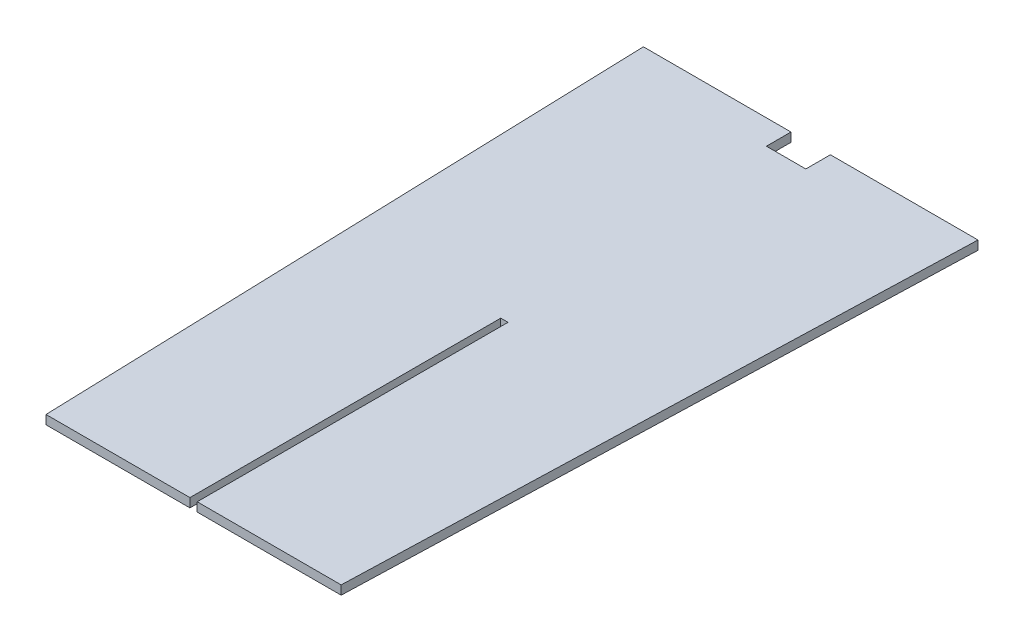
ISO-10303-21;
HEADER;
FILE_DESCRIPTION(('STEP AP214'),'2;1');
FILE_NAME('part.step','',(''),(''),'','','');
FILE_SCHEMA(('AUTOMOTIVE_DESIGN { 1 0 10303 214 1 1 1 1 }'));
ENDSEC;
DATA;
#1=APPLICATION_CONTEXT('core data for automotive mechanical design processes');
#2=APPLICATION_PROTOCOL_DEFINITION('international standard','automotive_design',2000,#1);
#3=PRODUCT_CONTEXT('',#1,'mechanical');
#4=PRODUCT('Part','Part','',(#3));
#5=PRODUCT_RELATED_PRODUCT_CATEGORY('part','',(#4));
#6=PRODUCT_DEFINITION_FORMATION('','',#4);
#7=PRODUCT_DEFINITION_CONTEXT('part definition',#1,'design');
#8=PRODUCT_DEFINITION('design','',#6,#7);
#9=PRODUCT_DEFINITION_SHAPE('','',#8);
#10=(LENGTH_UNIT() NAMED_UNIT(*) SI_UNIT(.MILLI.,.METRE.));
#11=(NAMED_UNIT(*) PLANE_ANGLE_UNIT() SI_UNIT($,.RADIAN.));
#12=(NAMED_UNIT(*) SI_UNIT($,.STERADIAN.) SOLID_ANGLE_UNIT());
#13=UNCERTAINTY_MEASURE_WITH_UNIT(LENGTH_MEASURE(1.E-05),#10,'distance_accuracy_value','');
#14=(GEOMETRIC_REPRESENTATION_CONTEXT(3) GLOBAL_UNCERTAINTY_ASSIGNED_CONTEXT((#13)) GLOBAL_UNIT_ASSIGNED_CONTEXT((#10,
#11,#12)) REPRESENTATION_CONTEXT('',''));
#15=CARTESIAN_POINT('',(0.,0.,0.));
#16=DIRECTION('',(0.,0.,1.));
#17=DIRECTION('',(1.,0.,0.));
#18=AXIS2_PLACEMENT_3D('',#15,#16,#17);
#19=CARTESIAN_POINT('',(262.6692014748,-6.35,-448.360447089144));
#20=DIRECTION('',(-0.999489318575964,0.,0.0319546874895447));
#21=DIRECTION('',(0.0319546874895447,0.,0.999489318575964));
#22=AXIS2_PLACEMENT_3D('',#19,#20,#21);
#23=PLANE('',#22);
#24=DIRECTION('',(0.0319546874895447,0.,0.999489318575964));
#25=VECTOR('',#24,1.);
#26=CARTESIAN_POINT('',(262.6692014748,0.,-448.360447089144));
#27=LINE('',#26,#25);
#28=CARTESIAN_POINT('',(262.6692014748,0.,-448.360447089144));
#29=VERTEX_POINT('',#28);
#30=CARTESIAN_POINT('',(276.6773014748,0.,-10.2104470891437));
#31=VERTEX_POINT('',#30);
#32=EDGE_CURVE('E166',#29,#31,#27,.T.);
#33=ORIENTED_EDGE('',*,*,#32,.F.);
#34=DIRECTION('',(0.,1.,0.));
#35=VECTOR('',#34,1.);
#36=CARTESIAN_POINT('',(262.6692014748,-6.35,-448.360447089144));
#37=LINE('',#36,#35);
#38=CARTESIAN_POINT('',(262.6692014748,-6.35,-448.360447089144));
#39=VERTEX_POINT('',#38);
#40=EDGE_CURVE('E11',#39,#29,#37,.T.);
#41=ORIENTED_EDGE('',*,*,#40,.F.);
#42=DIRECTION('',(0.0319546874895447,0.,0.999489318575964));
#43=VECTOR('',#42,1.);
#44=CARTESIAN_POINT('',(262.6692014748,-6.35,-448.360447089144));
#45=LINE('',#44,#43);
#46=CARTESIAN_POINT('',(276.6773014748,-6.35,-10.2104470891437));
#47=VERTEX_POINT('',#46);
#48=EDGE_CURVE('E210',#39,#47,#45,.T.);
#49=ORIENTED_EDGE('',*,*,#48,.T.);
#50=DIRECTION('',(0.,1.,0.));
#51=VECTOR('',#50,1.);
#52=CARTESIAN_POINT('',(276.6773014748,-6.35,-10.2104470891437));
#53=LINE('',#52,#51);
#54=EDGE_CURVE('E42',#47,#31,#53,.T.);
#55=ORIENTED_EDGE('',*,*,#54,.T.);
#56=EDGE_LOOP('',(#33,#41,#49,#55));
#57=FACE_BOUND('',#56,.T.);
#58=ADVANCED_FACE('F39',(#57),#23,.T.);
#59=CARTESIAN_POINT('',(262.6692014748,-6.35,-448.360447089144));
#60=DIRECTION('',(0.,0.,-1.));
#61=DIRECTION('',(-1.,0.,0.));
#62=AXIS2_PLACEMENT_3D('',#59,#60,#61);
#63=PLANE('',#62);
#64=DIRECTION('',(-1.,0.,0.));
#65=VECTOR('',#64,1.);
#66=CARTESIAN_POINT('',(262.6692014748,0.,-448.360447089144));
#67=LINE('',#66,#65);
#68=CARTESIAN_POINT('',(367.4632514748,0.,-448.360447089144));
#69=VERTEX_POINT('',#68);
#70=EDGE_CURVE('E207',#69,#29,#67,.T.);
#71=ORIENTED_EDGE('',*,*,#70,.F.);
#72=DIRECTION('',(0.,1.,0.));
#73=VECTOR('',#72,1.);
#74=CARTESIAN_POINT('',(367.4632514748,-6.35,-448.360447089144));
#75=LINE('',#74,#73);
#76=CARTESIAN_POINT('',(367.4632514748,-6.35,-448.360447089144));
#77=VERTEX_POINT('',#76);
#78=EDGE_CURVE('E49',#77,#69,#75,.T.);
#79=ORIENTED_EDGE('',*,*,#78,.F.);
#80=DIRECTION('',(-1.,0.,0.));
#81=VECTOR('',#80,1.);
#82=CARTESIAN_POINT('',(262.6692014748,-6.35,-448.360447089144));
#83=LINE('',#82,#81);
#84=EDGE_CURVE('E152',#77,#39,#83,.T.);
#85=ORIENTED_EDGE('',*,*,#84,.T.);
#86=ORIENTED_EDGE('',*,*,#40,.T.);
#87=EDGE_LOOP('',(#71,#79,#85,#86));
#88=FACE_BOUND('',#87,.T.);
#89=ADVANCED_FACE('F240',(#88),#63,.T.);
#90=CARTESIAN_POINT('',(367.4632514748,-6.35,-448.360447089144));
#91=DIRECTION('',(1.,0.,0.));
#92=DIRECTION('',(0.,0.,-1.));
#93=AXIS2_PLACEMENT_3D('',#90,#91,#92);
#94=PLANE('',#93);
#95=DIRECTION('',(0.,0.,-1.));
#96=VECTOR('',#95,1.);
#97=CARTESIAN_POINT('',(367.4632514748,0.,-448.360447089144));
#98=LINE('',#97,#96);
#99=CARTESIAN_POINT('',(367.4632514748,0.,-430.897947089144));
#100=VERTEX_POINT('',#99);
#101=EDGE_CURVE('E138',#100,#69,#98,.T.);
#102=ORIENTED_EDGE('',*,*,#101,.F.);
#103=DIRECTION('',(0.,1.,0.));
#104=VECTOR('',#103,1.);
#105=CARTESIAN_POINT('',(367.4632514748,-6.35,-430.897947089144));
#106=LINE('',#105,#104);
#107=CARTESIAN_POINT('',(367.4632514748,-6.35,-430.897947089144));
#108=VERTEX_POINT('',#107);
#109=EDGE_CURVE('E133',#108,#100,#106,.T.);
#110=ORIENTED_EDGE('',*,*,#109,.F.);
#111=DIRECTION('',(0.,0.,-1.));
#112=VECTOR('',#111,1.);
#113=CARTESIAN_POINT('',(367.4632514748,-6.35,-448.360447089144));
#114=LINE('',#113,#112);
#115=EDGE_CURVE('E136',#108,#77,#114,.T.);
#116=ORIENTED_EDGE('',*,*,#115,.T.);
#117=ORIENTED_EDGE('',*,*,#78,.T.);
#118=EDGE_LOOP('',(#102,#110,#116,#117));
#119=FACE_BOUND('',#118,.T.);
#120=ADVANCED_FACE('F135',(#119),#94,.T.);
#121=CARTESIAN_POINT('',(367.4632514748,-6.35,-430.897947089144));
#122=DIRECTION('',(0.,0.,-1.));
#123=DIRECTION('',(-1.,0.,0.));
#124=AXIS2_PLACEMENT_3D('',#121,#122,#123);
#125=PLANE('',#124);
#126=DIRECTION('',(-1.,0.,0.));
#127=VECTOR('',#126,1.);
#128=CARTESIAN_POINT('',(367.4632514748,0.,-430.897947089144));
#129=LINE('',#128,#127);
#130=CARTESIAN_POINT('',(395.4413514748,0.,-430.897947089144));
#131=VERTEX_POINT('',#130);
#132=EDGE_CURVE('E202',#131,#100,#129,.T.);
#133=ORIENTED_EDGE('',*,*,#132,.F.);
#134=DIRECTION('',(0.,1.,0.));
#135=VECTOR('',#134,1.);
#136=CARTESIAN_POINT('',(395.4413514748,-6.35,-430.897947089144));
#137=LINE('',#136,#135);
#138=CARTESIAN_POINT('',(395.4413514748,-6.35,-430.897947089144));
#139=VERTEX_POINT('',#138);
#140=EDGE_CURVE('E144',#139,#131,#137,.T.);
#141=ORIENTED_EDGE('',*,*,#140,.F.);
#142=DIRECTION('',(-1.,0.,0.));
#143=VECTOR('',#142,1.);
#144=CARTESIAN_POINT('',(367.4632514748,-6.35,-430.897947089144));
#145=LINE('',#144,#143);
#146=EDGE_CURVE('E150',#139,#108,#145,.T.);
#147=ORIENTED_EDGE('',*,*,#146,.T.);
#148=ORIENTED_EDGE('',*,*,#109,.T.);
#149=EDGE_LOOP('',(#133,#141,#147,#148));
#150=FACE_BOUND('',#149,.T.);
#151=ADVANCED_FACE('F155',(#150),#125,.T.);
#152=CARTESIAN_POINT('',(395.4413514748,-6.35,-448.360447089144));
#153=DIRECTION('',(-1.,0.,0.));
#154=DIRECTION('',(0.,0.,1.));
#155=AXIS2_PLACEMENT_3D('',#152,#153,#154);
#156=PLANE('',#155);
#157=DIRECTION('',(0.,0.,1.));
#158=VECTOR('',#157,1.);
#159=CARTESIAN_POINT('',(395.4413514748,0.,-448.360447089144));
#160=LINE('',#159,#158);
#161=CARTESIAN_POINT('',(395.4413514748,0.,-448.360447089144));
#162=VERTEX_POINT('',#161);
#163=EDGE_CURVE('E198',#162,#131,#160,.T.);
#164=ORIENTED_EDGE('',*,*,#163,.F.);
#165=DIRECTION('',(0.,1.,0.));
#166=VECTOR('',#165,1.);
#167=CARTESIAN_POINT('',(395.4413514748,-6.35,-448.360447089144));
#168=LINE('',#167,#166);
#169=CARTESIAN_POINT('',(395.4413514748,-6.35,-448.360447089144));
#170=VERTEX_POINT('',#169);
#171=EDGE_CURVE('E216',#170,#162,#168,.T.);
#172=ORIENTED_EDGE('',*,*,#171,.F.);
#173=DIRECTION('',(0.,0.,1.));
#174=VECTOR('',#173,1.);
#175=CARTESIAN_POINT('',(395.4413514748,-6.35,-448.360447089144));
#176=LINE('',#175,#174);
#177=EDGE_CURVE('E157',#170,#139,#176,.T.);
#178=ORIENTED_EDGE('',*,*,#177,.T.);
#179=ORIENTED_EDGE('',*,*,#140,.T.);
#180=EDGE_LOOP('',(#164,#172,#178,#179));
#181=FACE_BOUND('',#180,.T.);
#182=ADVANCED_FACE('F253',(#181),#156,.T.);
#183=CARTESIAN_POINT('',(395.4413514748,-6.35,-448.360447089144));
#184=DIRECTION('',(0.,0.,-1.));
#185=DIRECTION('',(-1.,0.,0.));
#186=AXIS2_PLACEMENT_3D('',#183,#184,#185);
#187=PLANE('',#186);
#188=DIRECTION('',(-1.,0.,0.));
#189=VECTOR('',#188,1.);
#190=CARTESIAN_POINT('',(395.4413514748,0.,-448.360447089144));
#191=LINE('',#190,#189);
#192=CARTESIAN_POINT('',(500.2354014748,0.,-448.360447089144));
#193=VERTEX_POINT('',#192);
#194=EDGE_CURVE('E194',#193,#162,#191,.T.);
#195=ORIENTED_EDGE('',*,*,#194,.F.);
#196=DIRECTION('',(0.,1.,0.));
#197=VECTOR('',#196,1.);
#198=CARTESIAN_POINT('',(500.2354014748,-6.35,-448.360447089144));
#199=LINE('',#198,#197);
#200=CARTESIAN_POINT('',(500.2354014748,-6.35,-448.360447089144));
#201=VERTEX_POINT('',#200);
#202=EDGE_CURVE('E219',#201,#193,#199,.T.);
#203=ORIENTED_EDGE('',*,*,#202,.F.);
#204=DIRECTION('',(-1.,0.,0.));
#205=VECTOR('',#204,1.);
#206=CARTESIAN_POINT('',(395.4413514748,-6.35,-448.360447089144));
#207=LINE('',#206,#205);
#208=EDGE_CURVE('E160',#201,#170,#207,.T.);
#209=ORIENTED_EDGE('',*,*,#208,.T.);
#210=ORIENTED_EDGE('',*,*,#171,.T.);
#211=EDGE_LOOP('',(#195,#203,#209,#210));
#212=FACE_BOUND('',#211,.T.);
#213=ADVANCED_FACE('F256',(#212),#187,.T.);
#214=CARTESIAN_POINT('',(500.2354014748,-6.35,-448.360447089144));
#215=DIRECTION('',(0.999489318575964,0.,0.0319546874895444));
#216=DIRECTION('',(0.0319546874895444,0.,-0.999489318575964));
#217=AXIS2_PLACEMENT_3D('',#214,#215,#216);
#218=PLANE('',#217);
#219=DIRECTION('',(0.0319546874895444,0.,-0.999489318575964));
#220=VECTOR('',#219,1.);
#221=CARTESIAN_POINT('',(500.2354014748,0.,-448.360447089144));
#222=LINE('',#221,#220);
#223=CARTESIAN_POINT('',(486.2273014748,0.,-10.2104470891437));
#224=VERTEX_POINT('',#223);
#225=EDGE_CURVE('E190',#224,#193,#222,.T.);
#226=ORIENTED_EDGE('',*,*,#225,.F.);
#227=DIRECTION('',(0.,1.,0.));
#228=VECTOR('',#227,1.);
#229=CARTESIAN_POINT('',(486.2273014748,-6.35,-10.2104470891437));
#230=LINE('',#229,#228);
#231=CARTESIAN_POINT('',(486.2273014748,-6.35,-10.2104470891437));
#232=VERTEX_POINT('',#231);
#233=EDGE_CURVE('E222',#232,#224,#230,.T.);
#234=ORIENTED_EDGE('',*,*,#233,.F.);
#235=DIRECTION('',(0.0319546874895444,0.,-0.999489318575964));
#236=VECTOR('',#235,1.);
#237=CARTESIAN_POINT('',(500.2354014748,-6.35,-448.360447089144));
#238=LINE('',#237,#236);
#239=EDGE_CURVE('E382',#232,#201,#238,.T.);
#240=ORIENTED_EDGE('',*,*,#239,.T.);
#241=ORIENTED_EDGE('',*,*,#202,.T.);
#242=EDGE_LOOP('',(#226,#234,#240,#241));
#243=FACE_BOUND('',#242,.T.);
#244=ADVANCED_FACE('F260',(#243),#218,.T.);
#245=CARTESIAN_POINT('',(384.0319889748,-6.35,-10.2104470891437));
#246=DIRECTION('',(0.,0.,1.));
#247=DIRECTION('',(1.,0.,0.));
#248=AXIS2_PLACEMENT_3D('',#245,#246,#247);
#249=PLANE('',#248);
#250=DIRECTION('',(1.,0.,0.));
#251=VECTOR('',#250,1.);
#252=CARTESIAN_POINT('',(384.0319889748,0.,-10.2104470891437));
#253=LINE('',#252,#251);
#254=CARTESIAN_POINT('',(384.0319889748,0.,-10.2104470891437));
#255=VERTEX_POINT('',#254);
#256=EDGE_CURVE('E186',#255,#224,#253,.T.);
#257=ORIENTED_EDGE('',*,*,#256,.F.);
#258=DIRECTION('',(0.,1.,0.));
#259=VECTOR('',#258,1.);
#260=CARTESIAN_POINT('',(384.0319889748,-6.35,-10.2104470891437));
#261=LINE('',#260,#259);
#262=CARTESIAN_POINT('',(384.0319889748,-6.35,-10.2104470891437));
#263=VERTEX_POINT('',#262);
#264=EDGE_CURVE('E225',#263,#255,#261,.T.);
#265=ORIENTED_EDGE('',*,*,#264,.F.);
#266=DIRECTION('',(1.,0.,0.));
#267=VECTOR('',#266,1.);
#268=CARTESIAN_POINT('',(384.0319889748,-6.35,-10.2104470891437));
#269=LINE('',#268,#267);
#270=EDGE_CURVE('E388',#263,#232,#269,.T.);
#271=ORIENTED_EDGE('',*,*,#270,.T.);
#272=ORIENTED_EDGE('',*,*,#233,.T.);
#273=EDGE_LOOP('',(#257,#265,#271,#272));
#274=FACE_BOUND('',#273,.T.);
#275=ADVANCED_FACE('F264',(#274),#249,.T.);
#276=CARTESIAN_POINT('',(384.0319889748,-6.35,-10.2104470891437));
#277=DIRECTION('',(-1.,0.,0.));
#278=DIRECTION('',(0.,0.,1.));
#279=AXIS2_PLACEMENT_3D('',#276,#277,#278);
#280=PLANE('',#279);
#281=DIRECTION('',(0.,0.,1.));
#282=VECTOR('',#281,1.);
#283=CARTESIAN_POINT('',(384.0319889748,0.,-10.2104470891437));
#284=LINE('',#283,#282);
#285=CARTESIAN_POINT('',(384.0319889748,0.,-230.872947089144));
#286=VERTEX_POINT('',#285);
#287=EDGE_CURVE('E182',#286,#255,#284,.T.);
#288=ORIENTED_EDGE('',*,*,#287,.F.);
#289=DIRECTION('',(0.,1.,0.));
#290=VECTOR('',#289,1.);
#291=CARTESIAN_POINT('',(384.0319889748,-6.35,-230.872947089144));
#292=LINE('',#291,#290);
#293=CARTESIAN_POINT('',(384.0319889748,-6.35,-230.872947089144));
#294=VERTEX_POINT('',#293);
#295=EDGE_CURVE('E228',#294,#286,#292,.T.);
#296=ORIENTED_EDGE('',*,*,#295,.F.);
#297=DIRECTION('',(0.,0.,1.));
#298=VECTOR('',#297,1.);
#299=CARTESIAN_POINT('',(384.0319889748,-6.35,-10.2104470891437));
#300=LINE('',#299,#298);
#301=EDGE_CURVE('E375',#294,#263,#300,.T.);
#302=ORIENTED_EDGE('',*,*,#301,.T.);
#303=ORIENTED_EDGE('',*,*,#264,.T.);
#304=EDGE_LOOP('',(#288,#296,#302,#303));
#305=FACE_BOUND('',#304,.T.);
#306=ADVANCED_FACE('F268',(#305),#280,.T.);
#307=CARTESIAN_POINT('',(378.8726139748,-6.35,-230.872947089144));
#308=DIRECTION('',(0.,0.,1.));
#309=DIRECTION('',(1.,0.,0.));
#310=AXIS2_PLACEMENT_3D('',#307,#308,#309);
#311=PLANE('',#310);
#312=DIRECTION('',(1.,0.,0.));
#313=VECTOR('',#312,1.);
#314=CARTESIAN_POINT('',(378.8726139748,0.,-230.872947089144));
#315=LINE('',#314,#313);
#316=CARTESIAN_POINT('',(378.8726139748,0.,-230.872947089144));
#317=VERTEX_POINT('',#316);
#318=EDGE_CURVE('E178',#317,#286,#315,.T.);
#319=ORIENTED_EDGE('',*,*,#318,.F.);
#320=DIRECTION('',(0.,1.,0.));
#321=VECTOR('',#320,1.);
#322=CARTESIAN_POINT('',(378.8726139748,-6.35,-230.872947089144));
#323=LINE('',#322,#321);
#324=CARTESIAN_POINT('',(378.8726139748,-6.35,-230.872947089144));
#325=VERTEX_POINT('',#324);
#326=EDGE_CURVE('E231',#325,#317,#323,.T.);
#327=ORIENTED_EDGE('',*,*,#326,.F.);
#328=DIRECTION('',(1.,0.,0.));
#329=VECTOR('',#328,1.);
#330=CARTESIAN_POINT('',(378.8726139748,-6.35,-230.872947089144));
#331=LINE('',#330,#329);
#332=EDGE_CURVE('E371',#325,#294,#331,.T.);
#333=ORIENTED_EDGE('',*,*,#332,.T.);
#334=ORIENTED_EDGE('',*,*,#295,.T.);
#335=EDGE_LOOP('',(#319,#327,#333,#334));
#336=FACE_BOUND('',#335,.T.);
#337=ADVANCED_FACE('F272',(#336),#311,.T.);
#338=CARTESIAN_POINT('',(378.8726139748,-6.35,-10.2104470891437));
#339=DIRECTION('',(1.,0.,0.));
#340=DIRECTION('',(0.,0.,-1.));
#341=AXIS2_PLACEMENT_3D('',#338,#339,#340);
#342=PLANE('',#341);
#343=DIRECTION('',(0.,0.,-1.));
#344=VECTOR('',#343,1.);
#345=CARTESIAN_POINT('',(378.8726139748,0.,-10.2104470891437));
#346=LINE('',#345,#344);
#347=CARTESIAN_POINT('',(378.8726139748,0.,-10.2104470891437));
#348=VERTEX_POINT('',#347);
#349=EDGE_CURVE('E174',#348,#317,#346,.T.);
#350=ORIENTED_EDGE('',*,*,#349,.F.);
#351=DIRECTION('',(0.,1.,0.));
#352=VECTOR('',#351,1.);
#353=CARTESIAN_POINT('',(378.8726139748,-6.35,-10.2104470891437));
#354=LINE('',#353,#352);
#355=CARTESIAN_POINT('',(378.8726139748,-6.35,-10.2104470891437));
#356=VERTEX_POINT('',#355);
#357=EDGE_CURVE('E233',#356,#348,#354,.T.);
#358=ORIENTED_EDGE('',*,*,#357,.F.);
#359=DIRECTION('',(0.,0.,-1.));
#360=VECTOR('',#359,1.);
#361=CARTESIAN_POINT('',(378.8726139748,-6.35,-10.2104470891437));
#362=LINE('',#361,#360);
#363=EDGE_CURVE('E397',#356,#325,#362,.T.);
#364=ORIENTED_EDGE('',*,*,#363,.T.);
#365=ORIENTED_EDGE('',*,*,#326,.T.);
#366=EDGE_LOOP('',(#350,#358,#364,#365));
#367=FACE_BOUND('',#366,.T.);
#368=ADVANCED_FACE('F276',(#367),#342,.T.);
#369=CARTESIAN_POINT('',(276.6773014748,-6.35,-10.2104470891437));
#370=DIRECTION('',(0.,0.,1.));
#371=DIRECTION('',(1.,0.,0.));
#372=AXIS2_PLACEMENT_3D('',#369,#370,#371);
#373=PLANE('',#372);
#374=DIRECTION('',(1.,0.,0.));
#375=VECTOR('',#374,1.);
#376=CARTESIAN_POINT('',(276.6773014748,0.,-10.2104470891437));
#377=LINE('',#376,#375);
#378=EDGE_CURVE('E170',#31,#348,#377,.T.);
#379=ORIENTED_EDGE('',*,*,#378,.F.);
#380=ORIENTED_EDGE('',*,*,#54,.F.);
#381=DIRECTION('',(1.,0.,0.));
#382=VECTOR('',#381,1.);
#383=CARTESIAN_POINT('',(276.6773014748,-6.35,-10.2104470891437));
#384=LINE('',#383,#382);
#385=EDGE_CURVE('E400',#47,#356,#384,.T.);
#386=ORIENTED_EDGE('',*,*,#385,.T.);
#387=ORIENTED_EDGE('',*,*,#357,.T.);
#388=EDGE_LOOP('',(#379,#380,#386,#387));
#389=FACE_BOUND('',#388,.T.);
#390=ADVANCED_FACE('F237',(#389),#373,.T.);
#391=CARTESIAN_POINT('',(0.,-6.35,0.));
#392=DIRECTION('',(0.,1.,0.));
#393=DIRECTION('',(0.,0.,1.));
#394=AXIS2_PLACEMENT_3D('',#391,#392,#393);
#395=PLANE('',#394);
#396=ORIENTED_EDGE('',*,*,#48,.F.);
#397=ORIENTED_EDGE('',*,*,#84,.F.);
#398=ORIENTED_EDGE('',*,*,#115,.F.);
#399=ORIENTED_EDGE('',*,*,#146,.F.);
#400=ORIENTED_EDGE('',*,*,#177,.F.);
#401=ORIENTED_EDGE('',*,*,#208,.F.);
#402=ORIENTED_EDGE('',*,*,#239,.F.);
#403=ORIENTED_EDGE('',*,*,#270,.F.);
#404=ORIENTED_EDGE('',*,*,#301,.F.);
#405=ORIENTED_EDGE('',*,*,#332,.F.);
#406=ORIENTED_EDGE('',*,*,#363,.F.);
#407=ORIENTED_EDGE('',*,*,#385,.F.);
#408=EDGE_LOOP('',(#396,#397,#398,#399,#400,#401,#402,#403,#404,#405,#406,#407));
#409=FACE_BOUND('',#408,.T.);
#410=ADVANCED_FACE('F148',(#409),#395,.F.);
#411=CARTESIAN_POINT('',(0.,0.,0.));
#412=DIRECTION('',(0.,1.,0.));
#413=DIRECTION('',(0.,0.,1.));
#414=AXIS2_PLACEMENT_3D('',#411,#412,#413);
#415=PLANE('',#414);
#416=ORIENTED_EDGE('',*,*,#32,.T.);
#417=ORIENTED_EDGE('',*,*,#378,.T.);
#418=ORIENTED_EDGE('',*,*,#349,.T.);
#419=ORIENTED_EDGE('',*,*,#318,.T.);
#420=ORIENTED_EDGE('',*,*,#287,.T.);
#421=ORIENTED_EDGE('',*,*,#256,.T.);
#422=ORIENTED_EDGE('',*,*,#225,.T.);
#423=ORIENTED_EDGE('',*,*,#194,.T.);
#424=ORIENTED_EDGE('',*,*,#163,.T.);
#425=ORIENTED_EDGE('',*,*,#132,.T.);
#426=ORIENTED_EDGE('',*,*,#101,.T.);
#427=ORIENTED_EDGE('',*,*,#70,.T.);
#428=EDGE_LOOP('',(#416,#417,#418,#419,#420,#421,#422,#423,#424,#425,#426,#427));
#429=FACE_BOUND('',#428,.T.);
#430=ADVANCED_FACE('F239',(#429),#415,.T.);
#431=CLOSED_SHELL('',(#58,#89,#120,#151,#182,#213,#244,#275,#306,#337,#368,#390,#410,#430));
#432=MANIFOLD_SOLID_BREP('B2',#431);
#433=ADVANCED_BREP_SHAPE_REPRESENTATION('',(#18,#432),#14);
#434=SHAPE_DEFINITION_REPRESENTATION(#9,#433);
ENDSEC;
END-ISO-10303-21;
